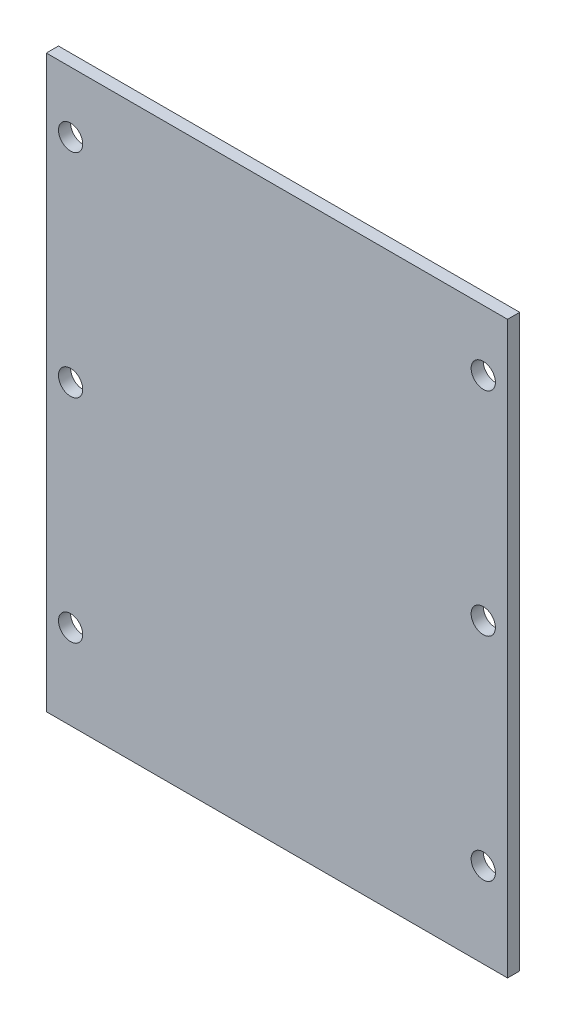
ISO-10303-21;
HEADER;
FILE_DESCRIPTION(('STEP AP214'),'2;1');
FILE_NAME('part.step','',(''),(''),'','','');
FILE_SCHEMA(('AUTOMOTIVE_DESIGN { 1 0 10303 214 1 1 1 1 }'));
ENDSEC;
DATA;
#1=APPLICATION_CONTEXT('core data for automotive mechanical design processes');
#2=APPLICATION_PROTOCOL_DEFINITION('international standard','automotive_design',2000,#1);
#3=PRODUCT_CONTEXT('',#1,'mechanical');
#4=PRODUCT('Part','Part','',(#3));
#5=PRODUCT_RELATED_PRODUCT_CATEGORY('part','',(#4));
#6=PRODUCT_DEFINITION_FORMATION('','',#4);
#7=PRODUCT_DEFINITION_CONTEXT('part definition',#1,'design');
#8=PRODUCT_DEFINITION('design','',#6,#7);
#9=PRODUCT_DEFINITION_SHAPE('','',#8);
#10=(LENGTH_UNIT() NAMED_UNIT(*) SI_UNIT(.MILLI.,.METRE.));
#11=(NAMED_UNIT(*) PLANE_ANGLE_UNIT() SI_UNIT($,.RADIAN.));
#12=(NAMED_UNIT(*) SI_UNIT($,.STERADIAN.) SOLID_ANGLE_UNIT());
#13=UNCERTAINTY_MEASURE_WITH_UNIT(LENGTH_MEASURE(1.E-05),#10,'distance_accuracy_value','');
#14=(GEOMETRIC_REPRESENTATION_CONTEXT(3) GLOBAL_UNCERTAINTY_ASSIGNED_CONTEXT((#13)) GLOBAL_UNIT_ASSIGNED_CONTEXT((#10,
#11,#12)) REPRESENTATION_CONTEXT('',''));
#15=CARTESIAN_POINT('',(0.,0.,0.));
#16=DIRECTION('',(0.,0.,1.));
#17=DIRECTION('',(1.,0.,0.));
#18=AXIS2_PLACEMENT_3D('',#15,#16,#17);
#19=CARTESIAN_POINT('',(-38.,47.,2.));
#20=DIRECTION('',(1.,0.,0.));
#21=DIRECTION('',(0.,1.,0.));
#22=AXIS2_PLACEMENT_3D('',#19,#20,#21);
#23=PLANE('',#22);
#24=DIRECTION('',(0.,-1.,0.));
#25=VECTOR('',#24,1.);
#26=CARTESIAN_POINT('',(-38.,47.,0.));
#27=LINE('',#26,#25);
#28=CARTESIAN_POINT('',(-38.,47.,0.));
#29=VERTEX_POINT('',#28);
#30=CARTESIAN_POINT('',(-38.,-47.,0.));
#31=VERTEX_POINT('',#30);
#32=EDGE_CURVE('E104',#29,#31,#27,.T.);
#33=ORIENTED_EDGE('',*,*,#32,.T.);
#34=DIRECTION('',(0.,0.,-1.));
#35=VECTOR('',#34,1.);
#36=CARTESIAN_POINT('',(-38.,-47.,2.));
#37=LINE('',#36,#35);
#38=CARTESIAN_POINT('',(-38.,-47.,2.));
#39=VERTEX_POINT('',#38);
#40=EDGE_CURVE('E11',#39,#31,#37,.T.);
#41=ORIENTED_EDGE('',*,*,#40,.F.);
#42=DIRECTION('',(0.,-1.,0.));
#43=VECTOR('',#42,1.);
#44=CARTESIAN_POINT('',(-38.,47.,2.));
#45=LINE('',#44,#43);
#46=CARTESIAN_POINT('',(-38.,47.,2.));
#47=VERTEX_POINT('',#46);
#48=EDGE_CURVE('E92',#47,#39,#45,.T.);
#49=ORIENTED_EDGE('',*,*,#48,.F.);
#50=DIRECTION('',(0.,0.,-1.));
#51=VECTOR('',#50,1.);
#52=CARTESIAN_POINT('',(-38.,47.,2.));
#53=LINE('',#52,#51);
#54=EDGE_CURVE('E100',#47,#29,#53,.T.);
#55=ORIENTED_EDGE('',*,*,#54,.T.);
#56=EDGE_LOOP('',(#33,#41,#49,#55));
#57=FACE_BOUND('',#56,.T.);
#58=ADVANCED_FACE('F41',(#57),#23,.F.);
#59=CARTESIAN_POINT('',(38.,-47.,2.));
#60=DIRECTION('',(0.,1.,0.));
#61=DIRECTION('',(-1.,0.,0.));
#62=AXIS2_PLACEMENT_3D('',#59,#60,#61);
#63=PLANE('',#62);
#64=DIRECTION('',(1.,0.,0.));
#65=VECTOR('',#64,1.);
#66=CARTESIAN_POINT('',(38.,-47.,0.));
#67=LINE('',#66,#65);
#68=CARTESIAN_POINT('',(38.,-47.,0.));
#69=VERTEX_POINT('',#68);
#70=EDGE_CURVE('E96',#31,#69,#67,.T.);
#71=ORIENTED_EDGE('',*,*,#70,.T.);
#72=DIRECTION('',(0.,0.,-1.));
#73=VECTOR('',#72,1.);
#74=CARTESIAN_POINT('',(38.,-47.,2.));
#75=LINE('',#74,#73);
#76=CARTESIAN_POINT('',(38.,-47.,2.));
#77=VERTEX_POINT('',#76);
#78=EDGE_CURVE('E49',#77,#69,#75,.T.);
#79=ORIENTED_EDGE('',*,*,#78,.F.);
#80=DIRECTION('',(1.,0.,0.));
#81=VECTOR('',#80,1.);
#82=CARTESIAN_POINT('',(38.,-47.,2.));
#83=LINE('',#82,#81);
#84=EDGE_CURVE('E87',#39,#77,#83,.T.);
#85=ORIENTED_EDGE('',*,*,#84,.F.);
#86=ORIENTED_EDGE('',*,*,#40,.T.);
#87=EDGE_LOOP('',(#71,#79,#85,#86));
#88=FACE_BOUND('',#87,.T.);
#89=ADVANCED_FACE('F95',(#88),#63,.F.);
#90=CARTESIAN_POINT('',(38.,47.,2.));
#91=DIRECTION('',(-1.,0.,0.));
#92=DIRECTION('',(0.,-1.,0.));
#93=AXIS2_PLACEMENT_3D('',#90,#91,#92);
#94=PLANE('',#93);
#95=DIRECTION('',(0.,1.,0.));
#96=VECTOR('',#95,1.);
#97=CARTESIAN_POINT('',(38.,47.,0.));
#98=LINE('',#97,#96);
#99=CARTESIAN_POINT('',(38.,47.,0.));
#100=VERTEX_POINT('',#99);
#101=EDGE_CURVE('E74',#69,#100,#98,.T.);
#102=ORIENTED_EDGE('',*,*,#101,.T.);
#103=DIRECTION('',(0.,0.,-1.));
#104=VECTOR('',#103,1.);
#105=CARTESIAN_POINT('',(38.,47.,2.));
#106=LINE('',#105,#104);
#107=CARTESIAN_POINT('',(38.,47.,2.));
#108=VERTEX_POINT('',#107);
#109=EDGE_CURVE('E97',#108,#100,#106,.T.);
#110=ORIENTED_EDGE('',*,*,#109,.F.);
#111=DIRECTION('',(0.,1.,0.));
#112=VECTOR('',#111,1.);
#113=CARTESIAN_POINT('',(38.,47.,2.));
#114=LINE('',#113,#112);
#115=EDGE_CURVE('E90',#77,#108,#114,.T.);
#116=ORIENTED_EDGE('',*,*,#115,.F.);
#117=ORIENTED_EDGE('',*,*,#78,.T.);
#118=EDGE_LOOP('',(#102,#110,#116,#117));
#119=FACE_BOUND('',#118,.T.);
#120=ADVANCED_FACE('F98',(#119),#94,.F.);
#121=CARTESIAN_POINT('',(38.,47.,2.));
#122=DIRECTION('',(0.,-1.,0.));
#123=DIRECTION('',(1.,0.,0.));
#124=AXIS2_PLACEMENT_3D('',#121,#122,#123);
#125=PLANE('',#124);
#126=DIRECTION('',(-1.,0.,0.));
#127=VECTOR('',#126,1.);
#128=CARTESIAN_POINT('',(38.,47.,0.));
#129=LINE('',#128,#127);
#130=EDGE_CURVE('E80',#100,#29,#129,.T.);
#131=ORIENTED_EDGE('',*,*,#130,.T.);
#132=ORIENTED_EDGE('',*,*,#54,.F.);
#133=DIRECTION('',(-1.,0.,0.));
#134=VECTOR('',#133,1.);
#135=CARTESIAN_POINT('',(38.,47.,2.));
#136=LINE('',#135,#134);
#137=EDGE_CURVE('E57',#108,#47,#136,.T.);
#138=ORIENTED_EDGE('',*,*,#137,.F.);
#139=ORIENTED_EDGE('',*,*,#109,.T.);
#140=EDGE_LOOP('',(#131,#132,#138,#139));
#141=FACE_BOUND('',#140,.T.);
#142=ADVANCED_FACE('F112',(#141),#125,.F.);
#143=CARTESIAN_POINT('',(0.,0.,2.));
#144=DIRECTION('',(0.,0.,-1.));
#145=DIRECTION('',(-1.,0.,0.));
#146=AXIS2_PLACEMENT_3D('',#143,#144,#145);
#147=PLANE('',#146);
#148=CARTESIAN_POINT('',(-34.,37.,2.));
#149=DIRECTION('',(0.,0.,1.));
#150=DIRECTION('',(1.,0.,0.));
#151=AXIS2_PLACEMENT_3D('',#148,#149,#150);
#152=CIRCLE('',#151,1.99999999999999);
#153=CARTESIAN_POINT('',(-32.,37.,2.));
#154=VERTEX_POINT('',#153);
#155=EDGE_CURVE('E127',#154,#154,#152,.T.);
#156=ORIENTED_EDGE('',*,*,#155,.F.);
#157=EDGE_LOOP('',(#156));
#158=FACE_BOUND('',#157,.T.);
#159=CARTESIAN_POINT('',(-34.,2.00000000000002,2.));
#160=DIRECTION('',(0.,0.,1.));
#161=DIRECTION('',(1.,0.,0.));
#162=AXIS2_PLACEMENT_3D('',#159,#160,#161);
#163=CIRCLE('',#162,1.99999999999999);
#164=CARTESIAN_POINT('',(-32.,2.00000000000002,2.));
#165=VERTEX_POINT('',#164);
#166=EDGE_CURVE('E133',#165,#165,#163,.T.);
#167=ORIENTED_EDGE('',*,*,#166,.F.);
#168=EDGE_LOOP('',(#167));
#169=FACE_BOUND('',#168,.T.);
#170=CARTESIAN_POINT('',(-34.,-33.,2.));
#171=DIRECTION('',(0.,0.,1.));
#172=DIRECTION('',(1.,0.,0.));
#173=AXIS2_PLACEMENT_3D('',#170,#171,#172);
#174=CIRCLE('',#173,1.99999999999999);
#175=CARTESIAN_POINT('',(-32.,-33.,2.));
#176=VERTEX_POINT('',#175);
#177=EDGE_CURVE('E139',#176,#176,#174,.T.);
#178=ORIENTED_EDGE('',*,*,#177,.F.);
#179=EDGE_LOOP('',(#178));
#180=FACE_BOUND('',#179,.T.);
#181=CARTESIAN_POINT('',(34.,-33.,2.));
#182=DIRECTION('',(0.,0.,1.));
#183=DIRECTION('',(1.,0.,0.));
#184=AXIS2_PLACEMENT_3D('',#181,#182,#183);
#185=CIRCLE('',#184,1.99999999999999);
#186=CARTESIAN_POINT('',(36.,-33.,2.));
#187=VERTEX_POINT('',#186);
#188=EDGE_CURVE('E145',#187,#187,#185,.T.);
#189=ORIENTED_EDGE('',*,*,#188,.F.);
#190=EDGE_LOOP('',(#189));
#191=FACE_BOUND('',#190,.T.);
#192=CARTESIAN_POINT('',(34.,2.00000000000002,2.));
#193=DIRECTION('',(0.,0.,1.));
#194=DIRECTION('',(1.,0.,0.));
#195=AXIS2_PLACEMENT_3D('',#192,#193,#194);
#196=CIRCLE('',#195,1.99999999999999);
#197=CARTESIAN_POINT('',(36.,2.00000000000002,2.));
#198=VERTEX_POINT('',#197);
#199=EDGE_CURVE('E121',#198,#198,#196,.T.);
#200=ORIENTED_EDGE('',*,*,#199,.F.);
#201=EDGE_LOOP('',(#200));
#202=FACE_BOUND('',#201,.T.);
#203=CARTESIAN_POINT('',(34.,37.,2.));
#204=DIRECTION('',(0.,0.,1.));
#205=DIRECTION('',(1.,0.,0.));
#206=AXIS2_PLACEMENT_3D('',#203,#204,#205);
#207=CIRCLE('',#206,1.99999999999999);
#208=CARTESIAN_POINT('',(36.,37.,2.));
#209=VERTEX_POINT('',#208);
#210=EDGE_CURVE('E118',#209,#209,#207,.T.);
#211=ORIENTED_EDGE('',*,*,#210,.F.);
#212=EDGE_LOOP('',(#211));
#213=FACE_BOUND('',#212,.T.);
#214=ORIENTED_EDGE('',*,*,#48,.T.);
#215=ORIENTED_EDGE('',*,*,#84,.T.);
#216=ORIENTED_EDGE('',*,*,#115,.T.);
#217=ORIENTED_EDGE('',*,*,#137,.T.);
#218=EDGE_LOOP('',(#214,#215,#216,#217));
#219=FACE_BOUND('',#218,.T.);
#220=ADVANCED_FACE('F88',(#158,#169,#180,#191,#202,#213,#219),#147,.F.);
#221=CARTESIAN_POINT('',(0.,0.,0.));
#222=DIRECTION('',(0.,0.,-1.));
#223=DIRECTION('',(-1.,0.,0.));
#224=AXIS2_PLACEMENT_3D('',#221,#222,#223);
#225=PLANE('',#224);
#226=CARTESIAN_POINT('',(-34.,37.,0.));
#227=DIRECTION('',(0.,0.,1.));
#228=DIRECTION('',(1.,0.,0.));
#229=AXIS2_PLACEMENT_3D('',#226,#227,#228);
#230=CIRCLE('',#229,1.99999999999999);
#231=CARTESIAN_POINT('',(-32.,37.,0.));
#232=VERTEX_POINT('',#231);
#233=EDGE_CURVE('E124',#232,#232,#230,.T.);
#234=ORIENTED_EDGE('',*,*,#233,.T.);
#235=EDGE_LOOP('',(#234));
#236=FACE_BOUND('',#235,.T.);
#237=CARTESIAN_POINT('',(-34.,2.00000000000002,0.));
#238=DIRECTION('',(0.,0.,1.));
#239=DIRECTION('',(1.,0.,0.));
#240=AXIS2_PLACEMENT_3D('',#237,#238,#239);
#241=CIRCLE('',#240,1.99999999999999);
#242=CARTESIAN_POINT('',(-32.,2.00000000000002,0.));
#243=VERTEX_POINT('',#242);
#244=EDGE_CURVE('E130',#243,#243,#241,.T.);
#245=ORIENTED_EDGE('',*,*,#244,.T.);
#246=EDGE_LOOP('',(#245));
#247=FACE_BOUND('',#246,.T.);
#248=CARTESIAN_POINT('',(-34.,-33.,0.));
#249=DIRECTION('',(0.,0.,1.));
#250=DIRECTION('',(1.,0.,0.));
#251=AXIS2_PLACEMENT_3D('',#248,#249,#250);
#252=CIRCLE('',#251,1.99999999999999);
#253=CARTESIAN_POINT('',(-32.,-33.,0.));
#254=VERTEX_POINT('',#253);
#255=EDGE_CURVE('E136',#254,#254,#252,.T.);
#256=ORIENTED_EDGE('',*,*,#255,.T.);
#257=EDGE_LOOP('',(#256));
#258=FACE_BOUND('',#257,.T.);
#259=CARTESIAN_POINT('',(34.,-33.,0.));
#260=DIRECTION('',(0.,0.,1.));
#261=DIRECTION('',(1.,0.,0.));
#262=AXIS2_PLACEMENT_3D('',#259,#260,#261);
#263=CIRCLE('',#262,1.99999999999999);
#264=CARTESIAN_POINT('',(36.,-33.,0.));
#265=VERTEX_POINT('',#264);
#266=EDGE_CURVE('E142',#265,#265,#263,.T.);
#267=ORIENTED_EDGE('',*,*,#266,.T.);
#268=EDGE_LOOP('',(#267));
#269=FACE_BOUND('',#268,.T.);
#270=CARTESIAN_POINT('',(34.,2.00000000000002,0.));
#271=DIRECTION('',(0.,0.,1.));
#272=DIRECTION('',(1.,0.,0.));
#273=AXIS2_PLACEMENT_3D('',#270,#271,#272);
#274=CIRCLE('',#273,1.99999999999999);
#275=CARTESIAN_POINT('',(36.,2.00000000000002,0.));
#276=VERTEX_POINT('',#275);
#277=EDGE_CURVE('E148',#276,#276,#274,.T.);
#278=ORIENTED_EDGE('',*,*,#277,.T.);
#279=EDGE_LOOP('',(#278));
#280=FACE_BOUND('',#279,.T.);
#281=CARTESIAN_POINT('',(34.,37.,0.));
#282=DIRECTION('',(0.,0.,1.));
#283=DIRECTION('',(1.,0.,0.));
#284=AXIS2_PLACEMENT_3D('',#281,#282,#283);
#285=CIRCLE('',#284,1.99999999999999);
#286=CARTESIAN_POINT('',(36.,37.,0.));
#287=VERTEX_POINT('',#286);
#288=EDGE_CURVE('E107',#287,#287,#285,.T.);
#289=ORIENTED_EDGE('',*,*,#288,.T.);
#290=EDGE_LOOP('',(#289));
#291=FACE_BOUND('',#290,.T.);
#292=ORIENTED_EDGE('',*,*,#32,.F.);
#293=ORIENTED_EDGE('',*,*,#130,.F.);
#294=ORIENTED_EDGE('',*,*,#101,.F.);
#295=ORIENTED_EDGE('',*,*,#70,.F.);
#296=EDGE_LOOP('',(#292,#293,#294,#295));
#297=FACE_BOUND('',#296,.T.);
#298=ADVANCED_FACE('F115',(#236,#247,#258,#269,#280,#291,#297),#225,.T.);
#299=CARTESIAN_POINT('',(34.,37.,0.));
#300=DIRECTION('',(0.,0.,1.));
#301=DIRECTION('',(1.,0.,0.));
#302=AXIS2_PLACEMENT_3D('',#299,#300,#301);
#303=CYLINDRICAL_SURFACE('',#302,1.99999999999999);
#304=ORIENTED_EDGE('',*,*,#288,.F.);
#305=EDGE_LOOP('',(#304));
#306=FACE_BOUND('',#305,.T.);
#307=ORIENTED_EDGE('',*,*,#210,.T.);
#308=EDGE_LOOP('',(#307));
#309=FACE_BOUND('',#308,.T.);
#310=ADVANCED_FACE('F162',(#306,#309),#303,.F.);
#311=CARTESIAN_POINT('',(34.,2.00000000000002,0.));
#312=DIRECTION('',(0.,0.,1.));
#313=DIRECTION('',(1.,0.,0.));
#314=AXIS2_PLACEMENT_3D('',#311,#312,#313);
#315=CYLINDRICAL_SURFACE('',#314,1.99999999999999);
#316=ORIENTED_EDGE('',*,*,#277,.F.);
#317=EDGE_LOOP('',(#316));
#318=FACE_BOUND('',#317,.T.);
#319=ORIENTED_EDGE('',*,*,#199,.T.);
#320=EDGE_LOOP('',(#319));
#321=FACE_BOUND('',#320,.T.);
#322=ADVANCED_FACE('F154',(#318,#321),#315,.F.);
#323=CARTESIAN_POINT('',(34.,-33.,0.));
#324=DIRECTION('',(0.,0.,1.));
#325=DIRECTION('',(1.,0.,0.));
#326=AXIS2_PLACEMENT_3D('',#323,#324,#325);
#327=CYLINDRICAL_SURFACE('',#326,1.99999999999999);
#328=ORIENTED_EDGE('',*,*,#266,.F.);
#329=EDGE_LOOP('',(#328));
#330=FACE_BOUND('',#329,.T.);
#331=ORIENTED_EDGE('',*,*,#188,.T.);
#332=EDGE_LOOP('',(#331));
#333=FACE_BOUND('',#332,.T.);
#334=ADVANCED_FACE('F170',(#330,#333),#327,.F.);
#335=CARTESIAN_POINT('',(-34.,-33.,0.));
#336=DIRECTION('',(0.,0.,1.));
#337=DIRECTION('',(1.,0.,0.));
#338=AXIS2_PLACEMENT_3D('',#335,#336,#337);
#339=CYLINDRICAL_SURFACE('',#338,1.99999999999999);
#340=ORIENTED_EDGE('',*,*,#255,.F.);
#341=EDGE_LOOP('',(#340));
#342=FACE_BOUND('',#341,.T.);
#343=ORIENTED_EDGE('',*,*,#177,.T.);
#344=EDGE_LOOP('',(#343));
#345=FACE_BOUND('',#344,.T.);
#346=ADVANCED_FACE('F221',(#342,#345),#339,.F.);
#347=CARTESIAN_POINT('',(-34.,2.00000000000002,0.));
#348=DIRECTION('',(0.,0.,1.));
#349=DIRECTION('',(1.,0.,0.));
#350=AXIS2_PLACEMENT_3D('',#347,#348,#349);
#351=CYLINDRICAL_SURFACE('',#350,1.99999999999999);
#352=ORIENTED_EDGE('',*,*,#244,.F.);
#353=EDGE_LOOP('',(#352));
#354=FACE_BOUND('',#353,.T.);
#355=ORIENTED_EDGE('',*,*,#166,.T.);
#356=EDGE_LOOP('',(#355));
#357=FACE_BOUND('',#356,.T.);
#358=ADVANCED_FACE('F231',(#354,#357),#351,.F.);
#359=CARTESIAN_POINT('',(-34.,37.,0.));
#360=DIRECTION('',(0.,0.,1.));
#361=DIRECTION('',(1.,0.,0.));
#362=AXIS2_PLACEMENT_3D('',#359,#360,#361);
#363=CYLINDRICAL_SURFACE('',#362,1.99999999999999);
#364=ORIENTED_EDGE('',*,*,#233,.F.);
#365=EDGE_LOOP('',(#364));
#366=FACE_BOUND('',#365,.T.);
#367=ORIENTED_EDGE('',*,*,#155,.T.);
#368=EDGE_LOOP('',(#367));
#369=FACE_BOUND('',#368,.T.);
#370=ADVANCED_FACE('F241',(#366,#369),#363,.F.);
#371=CLOSED_SHELL('',(#58,#89,#120,#142,#220,#298,#310,#322,#334,#346,#358,#370));
#372=MANIFOLD_SOLID_BREP('B2',#371);
#373=ADVANCED_BREP_SHAPE_REPRESENTATION('',(#18,#372),#14);
#374=SHAPE_DEFINITION_REPRESENTATION(#9,#373);
ENDSEC;
END-ISO-10303-21;
